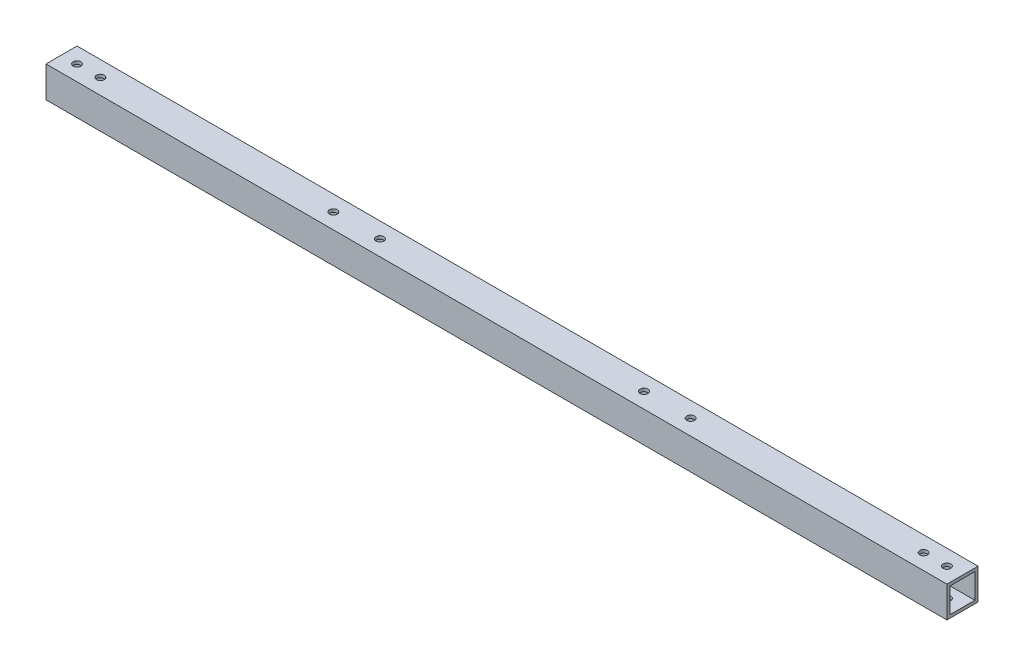
ISO-10303-21;
HEADER;
FILE_DESCRIPTION(('STEP AP214'),'2;1');
FILE_NAME('part.step','',(''),(''),'','','');
FILE_SCHEMA(('AUTOMOTIVE_DESIGN { 1 0 10303 214 1 1 1 1 }'));
ENDSEC;
DATA;
#1=APPLICATION_CONTEXT('core data for automotive mechanical design processes');
#2=APPLICATION_PROTOCOL_DEFINITION('international standard','automotive_design',2000,#1);
#3=PRODUCT_CONTEXT('',#1,'mechanical');
#4=PRODUCT('Part','Part','',(#3));
#5=PRODUCT_RELATED_PRODUCT_CATEGORY('part','',(#4));
#6=PRODUCT_DEFINITION_FORMATION('','',#4);
#7=PRODUCT_DEFINITION_CONTEXT('part definition',#1,'design');
#8=PRODUCT_DEFINITION('design','',#6,#7);
#9=PRODUCT_DEFINITION_SHAPE('','',#8);
#10=(LENGTH_UNIT() NAMED_UNIT(*) SI_UNIT(.MILLI.,.METRE.));
#11=(NAMED_UNIT(*) PLANE_ANGLE_UNIT() SI_UNIT($,.RADIAN.));
#12=(NAMED_UNIT(*) SI_UNIT($,.STERADIAN.) SOLID_ANGLE_UNIT());
#13=UNCERTAINTY_MEASURE_WITH_UNIT(LENGTH_MEASURE(1.E-05),#10,'distance_accuracy_value','');
#14=(GEOMETRIC_REPRESENTATION_CONTEXT(3) GLOBAL_UNCERTAINTY_ASSIGNED_CONTEXT((#13)) GLOBAL_UNIT_ASSIGNED_CONTEXT((#10,
#11,#12)) REPRESENTATION_CONTEXT('',''));
#15=CARTESIAN_POINT('',(0.,0.,0.));
#16=DIRECTION('',(0.,0.,1.));
#17=DIRECTION('',(1.,0.,0.));
#18=AXIS2_PLACEMENT_3D('',#15,#16,#17);
#19=CARTESIAN_POINT('',(580.,0.,0.));
#20=DIRECTION('',(1.,0.,0.));
#21=DIRECTION('',(0.,0.,-1.));
#22=AXIS2_PLACEMENT_3D('',#19,#20,#21);
#23=PLANE('',#22);
#24=DIRECTION('',(0.,1.,0.));
#25=VECTOR('',#24,1.);
#26=CARTESIAN_POINT('',(580.,10.,-9.99999999999999));
#27=LINE('',#26,#25);
#28=CARTESIAN_POINT('',(580.,-10.,-10.));
#29=VERTEX_POINT('',#28);
#30=CARTESIAN_POINT('',(580.,10.,-9.99999999999999));
#31=VERTEX_POINT('',#30);
#32=EDGE_CURVE('E141',#29,#31,#27,.T.);
#33=ORIENTED_EDGE('',*,*,#32,.T.);
#34=DIRECTION('',(0.,0.,1.));
#35=VECTOR('',#34,1.);
#36=CARTESIAN_POINT('',(580.,10.,10.));
#37=LINE('',#36,#35);
#38=CARTESIAN_POINT('',(580.,10.,10.));
#39=VERTEX_POINT('',#38);
#40=EDGE_CURVE('E144',#31,#39,#37,.T.);
#41=ORIENTED_EDGE('',*,*,#40,.T.);
#42=DIRECTION('',(0.,-1.,0.));
#43=VECTOR('',#42,1.);
#44=CARTESIAN_POINT('',(580.,10.,10.));
#45=LINE('',#44,#43);
#46=CARTESIAN_POINT('',(580.,-10.,10.));
#47=VERTEX_POINT('',#46);
#48=EDGE_CURVE('E147',#39,#47,#45,.T.);
#49=ORIENTED_EDGE('',*,*,#48,.T.);
#50=DIRECTION('',(0.,0.,-1.));
#51=VECTOR('',#50,1.);
#52=CARTESIAN_POINT('',(580.,-10.,10.));
#53=LINE('',#52,#51);
#54=EDGE_CURVE('E149',#47,#29,#53,.T.);
#55=ORIENTED_EDGE('',*,*,#54,.T.);
#56=EDGE_LOOP('',(#33,#41,#49,#55));
#57=FACE_BOUND('',#56,.T.);
#58=DIRECTION('',(0.,0.,1.));
#59=VECTOR('',#58,1.);
#60=CARTESIAN_POINT('',(580.,8.,8.));
#61=LINE('',#60,#59);
#62=CARTESIAN_POINT('',(580.,8.,-8.));
#63=VERTEX_POINT('',#62);
#64=CARTESIAN_POINT('',(580.,8.,8.));
#65=VERTEX_POINT('',#64);
#66=EDGE_CURVE('E111',#63,#65,#61,.T.);
#67=ORIENTED_EDGE('',*,*,#66,.F.);
#68=DIRECTION('',(0.,1.,0.));
#69=VECTOR('',#68,1.);
#70=CARTESIAN_POINT('',(580.,8.,-8.));
#71=LINE('',#70,#69);
#72=CARTESIAN_POINT('',(580.,-8.,-8.));
#73=VERTEX_POINT('',#72);
#74=EDGE_CURVE('E103',#73,#63,#71,.T.);
#75=ORIENTED_EDGE('',*,*,#74,.F.);
#76=DIRECTION('',(0.,0.,-1.));
#77=VECTOR('',#76,1.);
#78=CARTESIAN_POINT('',(580.,-8.,8.));
#79=LINE('',#78,#77);
#80=CARTESIAN_POINT('',(580.,-8.,8.));
#81=VERTEX_POINT('',#80);
#82=EDGE_CURVE('E125',#81,#73,#79,.T.);
#83=ORIENTED_EDGE('',*,*,#82,.F.);
#84=DIRECTION('',(0.,-1.,0.));
#85=VECTOR('',#84,1.);
#86=CARTESIAN_POINT('',(580.,8.,8.));
#87=LINE('',#86,#85);
#88=EDGE_CURVE('E123',#65,#81,#87,.T.);
#89=ORIENTED_EDGE('',*,*,#88,.F.);
#90=EDGE_LOOP('',(#67,#75,#83,#89));
#91=FACE_BOUND('',#90,.T.);
#92=ADVANCED_FACE('F36',(#57,#91),#23,.T.);
#93=CARTESIAN_POINT('',(0.,0.,0.));
#94=DIRECTION('',(1.,0.,0.));
#95=DIRECTION('',(0.,0.,-1.));
#96=AXIS2_PLACEMENT_3D('',#93,#94,#95);
#97=PLANE('',#96);
#98=DIRECTION('',(0.,1.,0.));
#99=VECTOR('',#98,1.);
#100=CARTESIAN_POINT('',(0.,10.,-9.99999999999999));
#101=LINE('',#100,#99);
#102=CARTESIAN_POINT('',(0.,-10.,-10.));
#103=VERTEX_POINT('',#102);
#104=CARTESIAN_POINT('',(0.,10.,-9.99999999999999));
#105=VERTEX_POINT('',#104);
#106=EDGE_CURVE('E119',#103,#105,#101,.T.);
#107=ORIENTED_EDGE('',*,*,#106,.F.);
#108=DIRECTION('',(0.,0.,-1.));
#109=VECTOR('',#108,1.);
#110=CARTESIAN_POINT('',(0.,-10.,10.));
#111=LINE('',#110,#109);
#112=CARTESIAN_POINT('',(0.,-10.,10.));
#113=VERTEX_POINT('',#112);
#114=EDGE_CURVE('E145',#113,#103,#111,.T.);
#115=ORIENTED_EDGE('',*,*,#114,.F.);
#116=DIRECTION('',(0.,-1.,0.));
#117=VECTOR('',#116,1.);
#118=CARTESIAN_POINT('',(0.,10.,10.));
#119=LINE('',#118,#117);
#120=CARTESIAN_POINT('',(0.,10.,10.));
#121=VERTEX_POINT('',#120);
#122=EDGE_CURVE('E156',#121,#113,#119,.T.);
#123=ORIENTED_EDGE('',*,*,#122,.F.);
#124=DIRECTION('',(0.,0.,1.));
#125=VECTOR('',#124,1.);
#126=CARTESIAN_POINT('',(0.,10.,10.));
#127=LINE('',#126,#125);
#128=EDGE_CURVE('E154',#105,#121,#127,.T.);
#129=ORIENTED_EDGE('',*,*,#128,.F.);
#130=EDGE_LOOP('',(#107,#115,#123,#129));
#131=FACE_BOUND('',#130,.T.);
#132=DIRECTION('',(0.,1.,0.));
#133=VECTOR('',#132,1.);
#134=CARTESIAN_POINT('',(0.,8.,-8.));
#135=LINE('',#134,#133);
#136=CARTESIAN_POINT('',(0.,-8.,-8.));
#137=VERTEX_POINT('',#136);
#138=CARTESIAN_POINT('',(0.,8.,-8.));
#139=VERTEX_POINT('',#138);
#140=EDGE_CURVE('E61',#137,#139,#135,.T.);
#141=ORIENTED_EDGE('',*,*,#140,.T.);
#142=DIRECTION('',(0.,0.,1.));
#143=VECTOR('',#142,1.);
#144=CARTESIAN_POINT('',(0.,8.,8.));
#145=LINE('',#144,#143);
#146=CARTESIAN_POINT('',(0.,8.,8.));
#147=VERTEX_POINT('',#146);
#148=EDGE_CURVE('E118',#139,#147,#145,.T.);
#149=ORIENTED_EDGE('',*,*,#148,.T.);
#150=DIRECTION('',(0.,-1.,0.));
#151=VECTOR('',#150,1.);
#152=CARTESIAN_POINT('',(0.,8.,8.));
#153=LINE('',#152,#151);
#154=CARTESIAN_POINT('',(0.,-8.,8.));
#155=VERTEX_POINT('',#154);
#156=EDGE_CURVE('E133',#147,#155,#153,.T.);
#157=ORIENTED_EDGE('',*,*,#156,.T.);
#158=DIRECTION('',(0.,0.,-1.));
#159=VECTOR('',#158,1.);
#160=CARTESIAN_POINT('',(0.,-8.,8.));
#161=LINE('',#160,#159);
#162=EDGE_CURVE('E112',#155,#137,#161,.T.);
#163=ORIENTED_EDGE('',*,*,#162,.T.);
#164=EDGE_LOOP('',(#141,#149,#157,#163));
#165=FACE_BOUND('',#164,.T.);
#166=ADVANCED_FACE('F275',(#131,#165),#97,.F.);
#167=CARTESIAN_POINT('',(580.,10.,-9.99999999999999));
#168=DIRECTION('',(0.,0.,1.));
#169=DIRECTION('',(0.,-1.,0.));
#170=AXIS2_PLACEMENT_3D('',#167,#168,#169);
#171=PLANE('',#170);
#172=ORIENTED_EDGE('',*,*,#106,.T.);
#173=DIRECTION('',(-1.,0.,0.));
#174=VECTOR('',#173,1.);
#175=CARTESIAN_POINT('',(580.,10.,-9.99999999999999));
#176=LINE('',#175,#174);
#177=EDGE_CURVE('E11',#31,#105,#176,.T.);
#178=ORIENTED_EDGE('',*,*,#177,.F.);
#179=ORIENTED_EDGE('',*,*,#32,.F.);
#180=DIRECTION('',(-1.,0.,0.));
#181=VECTOR('',#180,1.);
#182=CARTESIAN_POINT('',(580.,-10.,-10.));
#183=LINE('',#182,#181);
#184=EDGE_CURVE('E151',#29,#103,#183,.T.);
#185=ORIENTED_EDGE('',*,*,#184,.T.);
#186=EDGE_LOOP('',(#172,#178,#179,#185));
#187=FACE_BOUND('',#186,.T.);
#188=ADVANCED_FACE('F38',(#187),#171,.F.);
#189=CARTESIAN_POINT('',(580.,10.,10.));
#190=DIRECTION('',(0.,-1.,0.));
#191=DIRECTION('',(0.,0.,-1.));
#192=AXIS2_PLACEMENT_3D('',#189,#190,#191);
#193=PLANE('',#192);
#194=CARTESIAN_POINT('',(175.,10.,0.));
#195=DIRECTION('',(0.,1.,0.));
#196=DIRECTION('',(0.,0.,1.));
#197=AXIS2_PLACEMENT_3D('',#194,#195,#196);
#198=CIRCLE('',#197,2.5);
#199=CARTESIAN_POINT('',(175.,10.,2.5));
#200=VERTEX_POINT('',#199);
#201=EDGE_CURVE('E484',#200,#200,#198,.T.);
#202=ORIENTED_EDGE('',*,*,#201,.F.);
#203=EDGE_LOOP('',(#202));
#204=FACE_BOUND('',#203,.T.);
#205=CARTESIAN_POINT('',(375.,10.,0.));
#206=DIRECTION('',(0.,1.,0.));
#207=DIRECTION('',(0.,0.,1.));
#208=AXIS2_PLACEMENT_3D('',#205,#206,#207);
#209=CIRCLE('',#208,2.50000000000002);
#210=CARTESIAN_POINT('',(375.,10.,2.5));
#211=VERTEX_POINT('',#210);
#212=EDGE_CURVE('E497',#211,#211,#209,.T.);
#213=ORIENTED_EDGE('',*,*,#212,.F.);
#214=EDGE_LOOP('',(#213));
#215=FACE_BOUND('',#214,.T.);
#216=CARTESIAN_POINT('',(205.,10.,0.));
#217=DIRECTION('',(0.,1.,0.));
#218=DIRECTION('',(0.,0.,-1.));
#219=AXIS2_PLACEMENT_3D('',#216,#217,#218);
#220=CIRCLE('',#219,2.5);
#221=CARTESIAN_POINT('',(205.,10.,-2.5));
#222=VERTEX_POINT('',#221);
#223=EDGE_CURVE('E496',#222,#222,#220,.T.);
#224=ORIENTED_EDGE('',*,*,#223,.F.);
#225=EDGE_LOOP('',(#224));
#226=FACE_BOUND('',#225,.T.);
#227=CARTESIAN_POINT('',(405.,10.,0.));
#228=DIRECTION('',(0.,1.,0.));
#229=DIRECTION('',(0.,0.,-1.));
#230=AXIS2_PLACEMENT_3D('',#227,#228,#229);
#231=CIRCLE('',#230,2.49999999999996);
#232=CARTESIAN_POINT('',(405.,10.,-2.49999999999999));
#233=VERTEX_POINT('',#232);
#234=EDGE_CURVE('E490',#233,#233,#231,.T.);
#235=ORIENTED_EDGE('',*,*,#234,.F.);
#236=EDGE_LOOP('',(#235));
#237=FACE_BOUND('',#236,.T.);
#238=CARTESIAN_POINT('',(10.,10.,0.));
#239=DIRECTION('',(0.,1.,0.));
#240=DIRECTION('',(0.,0.,1.));
#241=AXIS2_PLACEMENT_3D('',#238,#239,#240);
#242=CIRCLE('',#241,2.5);
#243=CARTESIAN_POINT('',(10.,10.,2.5));
#244=VERTEX_POINT('',#243);
#245=EDGE_CURVE('E210',#244,#244,#242,.T.);
#246=ORIENTED_EDGE('',*,*,#245,.F.);
#247=EDGE_LOOP('',(#246));
#248=FACE_BOUND('',#247,.T.);
#249=CARTESIAN_POINT('',(555.,10.,1.04744440165294E-13));
#250=DIRECTION('',(0.,1.,0.));
#251=DIRECTION('',(0.,0.,1.));
#252=AXIS2_PLACEMENT_3D('',#249,#250,#251);
#253=CIRCLE('',#252,2.50000000000003);
#254=CARTESIAN_POINT('',(555.,10.,2.50000000000013));
#255=VERTEX_POINT('',#254);
#256=EDGE_CURVE('E207',#255,#255,#253,.T.);
#257=ORIENTED_EDGE('',*,*,#256,.F.);
#258=EDGE_LOOP('',(#257));
#259=FACE_BOUND('',#258,.T.);
#260=CARTESIAN_POINT('',(25.,10.,0.));
#261=DIRECTION('',(0.,1.,0.));
#262=DIRECTION('',(0.,0.,1.));
#263=AXIS2_PLACEMENT_3D('',#260,#261,#262);
#264=CIRCLE('',#263,2.5);
#265=CARTESIAN_POINT('',(25.,10.,2.5));
#266=VERTEX_POINT('',#265);
#267=EDGE_CURVE('E217',#266,#266,#264,.T.);
#268=ORIENTED_EDGE('',*,*,#267,.F.);
#269=EDGE_LOOP('',(#268));
#270=FACE_BOUND('',#269,.T.);
#271=CARTESIAN_POINT('',(570.,10.,0.));
#272=DIRECTION('',(0.,1.,0.));
#273=DIRECTION('',(0.,0.,1.));
#274=AXIS2_PLACEMENT_3D('',#271,#272,#273);
#275=CIRCLE('',#274,2.50000000000003);
#276=CARTESIAN_POINT('',(570.,10.,2.50000000000003));
#277=VERTEX_POINT('',#276);
#278=EDGE_CURVE('E222',#277,#277,#275,.T.);
#279=ORIENTED_EDGE('',*,*,#278,.F.);
#280=EDGE_LOOP('',(#279));
#281=FACE_BOUND('',#280,.T.);
#282=ORIENTED_EDGE('',*,*,#128,.T.);
#283=DIRECTION('',(-1.,0.,0.));
#284=VECTOR('',#283,1.);
#285=CARTESIAN_POINT('',(580.,10.,10.));
#286=LINE('',#285,#284);
#287=EDGE_CURVE('E45',#39,#121,#286,.T.);
#288=ORIENTED_EDGE('',*,*,#287,.F.);
#289=ORIENTED_EDGE('',*,*,#40,.F.);
#290=ORIENTED_EDGE('',*,*,#177,.T.);
#291=EDGE_LOOP('',(#282,#288,#289,#290));
#292=FACE_BOUND('',#291,.T.);
#293=ADVANCED_FACE('F261',(#204,#215,#226,#237,#248,#259,#270,#281,#292),#193,.F.);
#294=CARTESIAN_POINT('',(580.,10.,10.));
#295=DIRECTION('',(0.,0.,-1.));
#296=DIRECTION('',(0.,1.,0.));
#297=AXIS2_PLACEMENT_3D('',#294,#295,#296);
#298=PLANE('',#297);
#299=ORIENTED_EDGE('',*,*,#122,.T.);
#300=DIRECTION('',(-1.,0.,0.));
#301=VECTOR('',#300,1.);
#302=CARTESIAN_POINT('',(580.,-10.,10.));
#303=LINE('',#302,#301);
#304=EDGE_CURVE('E161',#47,#113,#303,.T.);
#305=ORIENTED_EDGE('',*,*,#304,.F.);
#306=ORIENTED_EDGE('',*,*,#48,.F.);
#307=ORIENTED_EDGE('',*,*,#287,.T.);
#308=EDGE_LOOP('',(#299,#305,#306,#307));
#309=FACE_BOUND('',#308,.T.);
#310=ADVANCED_FACE('F264',(#309),#298,.F.);
#311=CARTESIAN_POINT('',(580.,-10.,10.));
#312=DIRECTION('',(0.,1.,0.));
#313=DIRECTION('',(0.,0.,1.));
#314=AXIS2_PLACEMENT_3D('',#311,#312,#313);
#315=PLANE('',#314);
#316=CARTESIAN_POINT('',(175.,-10.,0.));
#317=DIRECTION('',(0.,1.,0.));
#318=DIRECTION('',(0.,0.,1.));
#319=AXIS2_PLACEMENT_3D('',#316,#317,#318);
#320=CIRCLE('',#319,2.5);
#321=CARTESIAN_POINT('',(175.,-10.,2.5));
#322=VERTEX_POINT('',#321);
#323=EDGE_CURVE('E186',#322,#322,#320,.T.);
#324=ORIENTED_EDGE('',*,*,#323,.T.);
#325=EDGE_LOOP('',(#324));
#326=FACE_BOUND('',#325,.T.);
#327=CARTESIAN_POINT('',(375.,-10.,0.));
#328=DIRECTION('',(0.,1.,0.));
#329=DIRECTION('',(0.,0.,1.));
#330=AXIS2_PLACEMENT_3D('',#327,#328,#329);
#331=CIRCLE('',#330,2.50000000000002);
#332=CARTESIAN_POINT('',(375.,-10.,2.5));
#333=VERTEX_POINT('',#332);
#334=EDGE_CURVE('E493',#333,#333,#331,.T.);
#335=ORIENTED_EDGE('',*,*,#334,.T.);
#336=EDGE_LOOP('',(#335));
#337=FACE_BOUND('',#336,.T.);
#338=CARTESIAN_POINT('',(205.,-10.,0.));
#339=DIRECTION('',(0.,1.,0.));
#340=DIRECTION('',(0.,0.,-1.));
#341=AXIS2_PLACEMENT_3D('',#338,#339,#340);
#342=CIRCLE('',#341,2.5);
#343=CARTESIAN_POINT('',(205.,-10.,-2.5));
#344=VERTEX_POINT('',#343);
#345=EDGE_CURVE('E502',#344,#344,#342,.T.);
#346=ORIENTED_EDGE('',*,*,#345,.T.);
#347=EDGE_LOOP('',(#346));
#348=FACE_BOUND('',#347,.T.);
#349=CARTESIAN_POINT('',(405.,-10.,0.));
#350=DIRECTION('',(0.,1.,0.));
#351=DIRECTION('',(0.,0.,-1.));
#352=AXIS2_PLACEMENT_3D('',#349,#350,#351);
#353=CIRCLE('',#352,2.49999999999996);
#354=CARTESIAN_POINT('',(405.,-10.,-2.49999999999999));
#355=VERTEX_POINT('',#354);
#356=EDGE_CURVE('E485',#355,#355,#353,.T.);
#357=ORIENTED_EDGE('',*,*,#356,.T.);
#358=EDGE_LOOP('',(#357));
#359=FACE_BOUND('',#358,.T.);
#360=CARTESIAN_POINT('',(10.,-10.,0.));
#361=DIRECTION('',(0.,1.,0.));
#362=DIRECTION('',(0.,0.,1.));
#363=AXIS2_PLACEMENT_3D('',#360,#361,#362);
#364=CIRCLE('',#363,2.5);
#365=CARTESIAN_POINT('',(10.,-10.,2.5));
#366=VERTEX_POINT('',#365);
#367=EDGE_CURVE('E170',#366,#366,#364,.T.);
#368=ORIENTED_EDGE('',*,*,#367,.T.);
#369=EDGE_LOOP('',(#368));
#370=FACE_BOUND('',#369,.T.);
#371=CARTESIAN_POINT('',(555.,-10.,1.04744440165294E-13));
#372=DIRECTION('',(0.,1.,0.));
#373=DIRECTION('',(0.,0.,1.));
#374=AXIS2_PLACEMENT_3D('',#371,#372,#373);
#375=CIRCLE('',#374,2.50000000000003);
#376=CARTESIAN_POINT('',(555.,-10.,2.50000000000013));
#377=VERTEX_POINT('',#376);
#378=EDGE_CURVE('E214',#377,#377,#375,.T.);
#379=ORIENTED_EDGE('',*,*,#378,.T.);
#380=EDGE_LOOP('',(#379));
#381=FACE_BOUND('',#380,.T.);
#382=CARTESIAN_POINT('',(25.,-10.,0.));
#383=DIRECTION('',(0.,1.,0.));
#384=DIRECTION('',(0.,0.,1.));
#385=AXIS2_PLACEMENT_3D('',#382,#383,#384);
#386=CIRCLE('',#385,2.5);
#387=CARTESIAN_POINT('',(25.,-10.,2.5));
#388=VERTEX_POINT('',#387);
#389=EDGE_CURVE('E225',#388,#388,#386,.T.);
#390=ORIENTED_EDGE('',*,*,#389,.T.);
#391=EDGE_LOOP('',(#390));
#392=FACE_BOUND('',#391,.T.);
#393=CARTESIAN_POINT('',(570.,-10.,0.));
#394=DIRECTION('',(0.,1.,0.));
#395=DIRECTION('',(0.,0.,1.));
#396=AXIS2_PLACEMENT_3D('',#393,#394,#395);
#397=CIRCLE('',#396,2.50000000000003);
#398=CARTESIAN_POINT('',(570.,-10.,2.50000000000003));
#399=VERTEX_POINT('',#398);
#400=EDGE_CURVE('E213',#399,#399,#397,.T.);
#401=ORIENTED_EDGE('',*,*,#400,.T.);
#402=EDGE_LOOP('',(#401));
#403=FACE_BOUND('',#402,.T.);
#404=ORIENTED_EDGE('',*,*,#114,.T.);
#405=ORIENTED_EDGE('',*,*,#184,.F.);
#406=ORIENTED_EDGE('',*,*,#54,.F.);
#407=ORIENTED_EDGE('',*,*,#304,.T.);
#408=EDGE_LOOP('',(#404,#405,#406,#407));
#409=FACE_BOUND('',#408,.T.);
#410=ADVANCED_FACE('F279',(#326,#337,#348,#359,#370,#381,#392,#403,#409),#315,.F.);
#411=CARTESIAN_POINT('',(580.,8.,-8.));
#412=DIRECTION('',(0.,0.,1.));
#413=DIRECTION('',(0.,-1.,0.));
#414=AXIS2_PLACEMENT_3D('',#411,#412,#413);
#415=PLANE('',#414);
#416=ORIENTED_EDGE('',*,*,#140,.F.);
#417=DIRECTION('',(-1.,0.,0.));
#418=VECTOR('',#417,1.);
#419=CARTESIAN_POINT('',(580.,-8.,-8.));
#420=LINE('',#419,#418);
#421=EDGE_CURVE('E107',#73,#137,#420,.T.);
#422=ORIENTED_EDGE('',*,*,#421,.F.);
#423=ORIENTED_EDGE('',*,*,#74,.T.);
#424=DIRECTION('',(-1.,0.,0.));
#425=VECTOR('',#424,1.);
#426=CARTESIAN_POINT('',(580.,8.,-8.));
#427=LINE('',#426,#425);
#428=EDGE_CURVE('E106',#63,#139,#427,.T.);
#429=ORIENTED_EDGE('',*,*,#428,.T.);
#430=EDGE_LOOP('',(#416,#422,#423,#429));
#431=FACE_BOUND('',#430,.T.);
#432=ADVANCED_FACE('F105',(#431),#415,.T.);
#433=CARTESIAN_POINT('',(580.,8.,8.));
#434=DIRECTION('',(0.,-1.,0.));
#435=DIRECTION('',(0.,0.,-1.));
#436=AXIS2_PLACEMENT_3D('',#433,#434,#435);
#437=PLANE('',#436);
#438=CARTESIAN_POINT('',(175.,8.,0.));
#439=DIRECTION('',(0.,-1.,0.));
#440=DIRECTION('',(0.,0.,-1.));
#441=AXIS2_PLACEMENT_3D('',#438,#439,#440);
#442=CIRCLE('',#441,2.5);
#443=CARTESIAN_POINT('',(175.,8.,-2.5));
#444=VERTEX_POINT('',#443);
#445=EDGE_CURVE('E204',#444,#444,#442,.T.);
#446=ORIENTED_EDGE('',*,*,#445,.F.);
#447=EDGE_LOOP('',(#446));
#448=FACE_BOUND('',#447,.T.);
#449=CARTESIAN_POINT('',(375.,8.,0.));
#450=DIRECTION('',(0.,-1.,0.));
#451=DIRECTION('',(0.,0.,-1.));
#452=AXIS2_PLACEMENT_3D('',#449,#450,#451);
#453=CIRCLE('',#452,2.50000000000002);
#454=CARTESIAN_POINT('',(375.,8.,-2.50000000000005));
#455=VERTEX_POINT('',#454);
#456=EDGE_CURVE('E192',#455,#455,#453,.T.);
#457=ORIENTED_EDGE('',*,*,#456,.F.);
#458=EDGE_LOOP('',(#457));
#459=FACE_BOUND('',#458,.T.);
#460=CARTESIAN_POINT('',(205.,8.,0.));
#461=DIRECTION('',(0.,-1.,0.));
#462=DIRECTION('',(0.,0.,-1.));
#463=AXIS2_PLACEMENT_3D('',#460,#461,#462);
#464=CIRCLE('',#463,2.5);
#465=CARTESIAN_POINT('',(205.,8.,-2.5));
#466=VERTEX_POINT('',#465);
#467=EDGE_CURVE('E189',#466,#466,#464,.T.);
#468=ORIENTED_EDGE('',*,*,#467,.F.);
#469=EDGE_LOOP('',(#468));
#470=FACE_BOUND('',#469,.T.);
#471=CARTESIAN_POINT('',(405.,8.,0.));
#472=DIRECTION('',(0.,-1.,0.));
#473=DIRECTION('',(0.,0.,-1.));
#474=AXIS2_PLACEMENT_3D('',#471,#472,#473);
#475=CIRCLE('',#474,2.49999999999996);
#476=CARTESIAN_POINT('',(405.,8.,-2.49999999999999));
#477=VERTEX_POINT('',#476);
#478=EDGE_CURVE('E185',#477,#477,#475,.T.);
#479=ORIENTED_EDGE('',*,*,#478,.F.);
#480=EDGE_LOOP('',(#479));
#481=FACE_BOUND('',#480,.T.);
#482=CARTESIAN_POINT('',(10.,8.,0.));
#483=DIRECTION('',(0.,-1.,0.));
#484=DIRECTION('',(0.,0.,-1.));
#485=AXIS2_PLACEMENT_3D('',#482,#483,#484);
#486=CIRCLE('',#485,2.5);
#487=CARTESIAN_POINT('',(10.,8.,-2.5));
#488=VERTEX_POINT('',#487);
#489=EDGE_CURVE('E131',#488,#488,#486,.T.);
#490=ORIENTED_EDGE('',*,*,#489,.F.);
#491=EDGE_LOOP('',(#490));
#492=FACE_BOUND('',#491,.T.);
#493=CARTESIAN_POINT('',(555.,8.,1.04744440165294E-13));
#494=DIRECTION('',(0.,-1.,0.));
#495=DIRECTION('',(0.,0.,-1.));
#496=AXIS2_PLACEMENT_3D('',#493,#494,#495);
#497=CIRCLE('',#496,2.50000000000003);
#498=CARTESIAN_POINT('',(555.,8.,-2.49999999999992));
#499=VERTEX_POINT('',#498);
#500=EDGE_CURVE('E178',#499,#499,#497,.T.);
#501=ORIENTED_EDGE('',*,*,#500,.F.);
#502=EDGE_LOOP('',(#501));
#503=FACE_BOUND('',#502,.T.);
#504=CARTESIAN_POINT('',(25.,8.,0.));
#505=DIRECTION('',(0.,-1.,0.));
#506=DIRECTION('',(0.,0.,-1.));
#507=AXIS2_PLACEMENT_3D('',#504,#505,#506);
#508=CIRCLE('',#507,2.5);
#509=CARTESIAN_POINT('',(25.,8.,-2.5));
#510=VERTEX_POINT('',#509);
#511=EDGE_CURVE('E174',#510,#510,#508,.T.);
#512=ORIENTED_EDGE('',*,*,#511,.F.);
#513=EDGE_LOOP('',(#512));
#514=FACE_BOUND('',#513,.T.);
#515=CARTESIAN_POINT('',(570.,8.,0.));
#516=DIRECTION('',(0.,-1.,0.));
#517=DIRECTION('',(0.,0.,-1.));
#518=AXIS2_PLACEMENT_3D('',#515,#516,#517);
#519=CIRCLE('',#518,2.50000000000003);
#520=CARTESIAN_POINT('',(570.,8.,-2.50000000000003));
#521=VERTEX_POINT('',#520);
#522=EDGE_CURVE('E169',#521,#521,#519,.T.);
#523=ORIENTED_EDGE('',*,*,#522,.F.);
#524=EDGE_LOOP('',(#523));
#525=FACE_BOUND('',#524,.T.);
#526=ORIENTED_EDGE('',*,*,#148,.F.);
#527=ORIENTED_EDGE('',*,*,#428,.F.);
#528=ORIENTED_EDGE('',*,*,#66,.T.);
#529=DIRECTION('',(-1.,0.,0.));
#530=VECTOR('',#529,1.);
#531=CARTESIAN_POINT('',(580.,8.,8.));
#532=LINE('',#531,#530);
#533=EDGE_CURVE('E120',#65,#147,#532,.T.);
#534=ORIENTED_EDGE('',*,*,#533,.T.);
#535=EDGE_LOOP('',(#526,#527,#528,#534));
#536=FACE_BOUND('',#535,.T.);
#537=ADVANCED_FACE('F115',(#448,#459,#470,#481,#492,#503,#514,#525,#536),#437,.T.);
#538=CARTESIAN_POINT('',(580.,8.,8.));
#539=DIRECTION('',(0.,0.,-1.));
#540=DIRECTION('',(0.,1.,0.));
#541=AXIS2_PLACEMENT_3D('',#538,#539,#540);
#542=PLANE('',#541);
#543=ORIENTED_EDGE('',*,*,#156,.F.);
#544=ORIENTED_EDGE('',*,*,#533,.F.);
#545=ORIENTED_EDGE('',*,*,#88,.T.);
#546=DIRECTION('',(-1.,0.,0.));
#547=VECTOR('',#546,1.);
#548=CARTESIAN_POINT('',(580.,-8.,8.));
#549=LINE('',#548,#547);
#550=EDGE_CURVE('E53',#81,#155,#549,.T.);
#551=ORIENTED_EDGE('',*,*,#550,.T.);
#552=EDGE_LOOP('',(#543,#544,#545,#551));
#553=FACE_BOUND('',#552,.T.);
#554=ADVANCED_FACE('F243',(#553),#542,.T.);
#555=CARTESIAN_POINT('',(580.,-8.,8.));
#556=DIRECTION('',(0.,1.,0.));
#557=DIRECTION('',(0.,0.,1.));
#558=AXIS2_PLACEMENT_3D('',#555,#556,#557);
#559=PLANE('',#558);
#560=CARTESIAN_POINT('',(175.,-8.,0.));
#561=DIRECTION('',(0.,1.,0.));
#562=DIRECTION('',(0.,0.,1.));
#563=AXIS2_PLACEMENT_3D('',#560,#561,#562);
#564=CIRCLE('',#563,2.5);
#565=CARTESIAN_POINT('',(175.,-8.,2.5));
#566=VERTEX_POINT('',#565);
#567=EDGE_CURVE('E40',#566,#566,#564,.T.);
#568=ORIENTED_EDGE('',*,*,#567,.F.);
#569=EDGE_LOOP('',(#568));
#570=FACE_BOUND('',#569,.T.);
#571=CARTESIAN_POINT('',(375.,-8.,0.));
#572=DIRECTION('',(0.,1.,0.));
#573=DIRECTION('',(0.,0.,1.));
#574=AXIS2_PLACEMENT_3D('',#571,#572,#573);
#575=CIRCLE('',#574,2.50000000000002);
#576=CARTESIAN_POINT('',(375.,-8.,2.5));
#577=VERTEX_POINT('',#576);
#578=EDGE_CURVE('E190',#577,#577,#575,.T.);
#579=ORIENTED_EDGE('',*,*,#578,.F.);
#580=EDGE_LOOP('',(#579));
#581=FACE_BOUND('',#580,.T.);
#582=CARTESIAN_POINT('',(205.,-8.,0.));
#583=DIRECTION('',(0.,1.,0.));
#584=DIRECTION('',(0.,0.,1.));
#585=AXIS2_PLACEMENT_3D('',#582,#583,#584);
#586=CIRCLE('',#585,2.5);
#587=CARTESIAN_POINT('',(205.,-8.,2.49999999999999));
#588=VERTEX_POINT('',#587);
#589=EDGE_CURVE('E187',#588,#588,#586,.T.);
#590=ORIENTED_EDGE('',*,*,#589,.F.);
#591=EDGE_LOOP('',(#590));
#592=FACE_BOUND('',#591,.T.);
#593=CARTESIAN_POINT('',(405.,-8.,0.));
#594=DIRECTION('',(0.,1.,0.));
#595=DIRECTION('',(0.,0.,1.));
#596=AXIS2_PLACEMENT_3D('',#593,#594,#595);
#597=CIRCLE('',#596,2.49999999999996);
#598=CARTESIAN_POINT('',(405.,-8.,2.49999999999994));
#599=VERTEX_POINT('',#598);
#600=EDGE_CURVE('E182',#599,#599,#597,.T.);
#601=ORIENTED_EDGE('',*,*,#600,.F.);
#602=EDGE_LOOP('',(#601));
#603=FACE_BOUND('',#602,.T.);
#604=CARTESIAN_POINT('',(10.,-8.,0.));
#605=DIRECTION('',(0.,1.,0.));
#606=DIRECTION('',(0.,0.,1.));
#607=AXIS2_PLACEMENT_3D('',#604,#605,#606);
#608=CIRCLE('',#607,2.5);
#609=CARTESIAN_POINT('',(10.,-8.,2.5));
#610=VERTEX_POINT('',#609);
#611=EDGE_CURVE('E179',#610,#610,#608,.T.);
#612=ORIENTED_EDGE('',*,*,#611,.F.);
#613=EDGE_LOOP('',(#612));
#614=FACE_BOUND('',#613,.T.);
#615=CARTESIAN_POINT('',(555.,-8.,1.04744440165294E-13));
#616=DIRECTION('',(0.,1.,0.));
#617=DIRECTION('',(0.,0.,1.));
#618=AXIS2_PLACEMENT_3D('',#615,#616,#617);
#619=CIRCLE('',#618,2.50000000000003);
#620=CARTESIAN_POINT('',(555.,-8.,2.50000000000013));
#621=VERTEX_POINT('',#620);
#622=EDGE_CURVE('E175',#621,#621,#619,.T.);
#623=ORIENTED_EDGE('',*,*,#622,.F.);
#624=EDGE_LOOP('',(#623));
#625=FACE_BOUND('',#624,.T.);
#626=CARTESIAN_POINT('',(25.,-8.,0.));
#627=DIRECTION('',(0.,1.,0.));
#628=DIRECTION('',(0.,0.,1.));
#629=AXIS2_PLACEMENT_3D('',#626,#627,#628);
#630=CIRCLE('',#629,2.5);
#631=CARTESIAN_POINT('',(25.,-8.,2.5));
#632=VERTEX_POINT('',#631);
#633=EDGE_CURVE('E171',#632,#632,#630,.T.);
#634=ORIENTED_EDGE('',*,*,#633,.F.);
#635=EDGE_LOOP('',(#634));
#636=FACE_BOUND('',#635,.T.);
#637=CARTESIAN_POINT('',(570.,-8.,0.));
#638=DIRECTION('',(0.,1.,0.));
#639=DIRECTION('',(0.,0.,1.));
#640=AXIS2_PLACEMENT_3D('',#637,#638,#639);
#641=CIRCLE('',#640,2.50000000000003);
#642=CARTESIAN_POINT('',(570.,-8.,2.50000000000003));
#643=VERTEX_POINT('',#642);
#644=EDGE_CURVE('E166',#643,#643,#641,.T.);
#645=ORIENTED_EDGE('',*,*,#644,.F.);
#646=EDGE_LOOP('',(#645));
#647=FACE_BOUND('',#646,.T.);
#648=ORIENTED_EDGE('',*,*,#162,.F.);
#649=ORIENTED_EDGE('',*,*,#550,.F.);
#650=ORIENTED_EDGE('',*,*,#82,.T.);
#651=ORIENTED_EDGE('',*,*,#421,.T.);
#652=EDGE_LOOP('',(#648,#649,#650,#651));
#653=FACE_BOUND('',#652,.T.);
#654=ADVANCED_FACE('F328',(#570,#581,#592,#603,#614,#625,#636,#647,#653),#559,.T.);
#655=CARTESIAN_POINT('',(570.,-10.,0.));
#656=DIRECTION('',(0.,1.,0.));
#657=DIRECTION('',(0.,0.,1.));
#658=AXIS2_PLACEMENT_3D('',#655,#656,#657);
#659=CYLINDRICAL_SURFACE('',#658,2.50000000000003);
#660=ORIENTED_EDGE('',*,*,#644,.T.);
#661=EDGE_LOOP('',(#660));
#662=FACE_BOUND('',#661,.T.);
#663=ORIENTED_EDGE('',*,*,#400,.F.);
#664=EDGE_LOOP('',(#663));
#665=FACE_BOUND('',#664,.T.);
#666=ADVANCED_FACE('F258',(#662,#665),#659,.F.);
#667=CARTESIAN_POINT('',(25.,-10.,0.));
#668=DIRECTION('',(0.,1.,0.));
#669=DIRECTION('',(0.,0.,1.));
#670=AXIS2_PLACEMENT_3D('',#667,#668,#669);
#671=CYLINDRICAL_SURFACE('',#670,2.5);
#672=ORIENTED_EDGE('',*,*,#633,.T.);
#673=EDGE_LOOP('',(#672));
#674=FACE_BOUND('',#673,.T.);
#675=ORIENTED_EDGE('',*,*,#389,.F.);
#676=EDGE_LOOP('',(#675));
#677=FACE_BOUND('',#676,.T.);
#678=ADVANCED_FACE('F345',(#674,#677),#671,.F.);
#679=CARTESIAN_POINT('',(555.,-10.,1.04744440165294E-13));
#680=DIRECTION('',(0.,1.,0.));
#681=DIRECTION('',(0.,0.,1.));
#682=AXIS2_PLACEMENT_3D('',#679,#680,#681);
#683=CYLINDRICAL_SURFACE('',#682,2.50000000000003);
#684=ORIENTED_EDGE('',*,*,#622,.T.);
#685=EDGE_LOOP('',(#684));
#686=FACE_BOUND('',#685,.T.);
#687=ORIENTED_EDGE('',*,*,#378,.F.);
#688=EDGE_LOOP('',(#687));
#689=FACE_BOUND('',#688,.T.);
#690=ADVANCED_FACE('F351',(#686,#689),#683,.F.);
#691=CARTESIAN_POINT('',(10.,-10.,0.));
#692=DIRECTION('',(0.,1.,0.));
#693=DIRECTION('',(0.,0.,1.));
#694=AXIS2_PLACEMENT_3D('',#691,#692,#693);
#695=CYLINDRICAL_SURFACE('',#694,2.5);
#696=ORIENTED_EDGE('',*,*,#611,.T.);
#697=EDGE_LOOP('',(#696));
#698=FACE_BOUND('',#697,.T.);
#699=ORIENTED_EDGE('',*,*,#367,.F.);
#700=EDGE_LOOP('',(#699));
#701=FACE_BOUND('',#700,.T.);
#702=ADVANCED_FACE('F256',(#698,#701),#695,.F.);
#703=ORIENTED_EDGE('',*,*,#522,.T.);
#704=EDGE_LOOP('',(#703));
#705=FACE_BOUND('',#704,.T.);
#706=ORIENTED_EDGE('',*,*,#278,.T.);
#707=EDGE_LOOP('',(#706));
#708=FACE_BOUND('',#707,.T.);
#709=ADVANCED_FACE('F252',(#705,#708),#659,.F.);
#710=ORIENTED_EDGE('',*,*,#511,.T.);
#711=EDGE_LOOP('',(#710));
#712=FACE_BOUND('',#711,.T.);
#713=ORIENTED_EDGE('',*,*,#267,.T.);
#714=EDGE_LOOP('',(#713));
#715=FACE_BOUND('',#714,.T.);
#716=ADVANCED_FACE('F255',(#712,#715),#671,.F.);
#717=ORIENTED_EDGE('',*,*,#500,.T.);
#718=EDGE_LOOP('',(#717));
#719=FACE_BOUND('',#718,.T.);
#720=ORIENTED_EDGE('',*,*,#256,.T.);
#721=EDGE_LOOP('',(#720));
#722=FACE_BOUND('',#721,.T.);
#723=ADVANCED_FACE('F361',(#719,#722),#683,.F.);
#724=ORIENTED_EDGE('',*,*,#489,.T.);
#725=EDGE_LOOP('',(#724));
#726=FACE_BOUND('',#725,.T.);
#727=ORIENTED_EDGE('',*,*,#245,.T.);
#728=EDGE_LOOP('',(#727));
#729=FACE_BOUND('',#728,.T.);
#730=ADVANCED_FACE('F238',(#726,#729),#695,.F.);
#731=CARTESIAN_POINT('',(405.,-10.,0.));
#732=DIRECTION('',(0.,1.,0.));
#733=DIRECTION('',(0.,0.,1.));
#734=AXIS2_PLACEMENT_3D('',#731,#732,#733);
#735=CYLINDRICAL_SURFACE('',#734,2.49999999999996);
#736=ORIENTED_EDGE('',*,*,#600,.T.);
#737=EDGE_LOOP('',(#736));
#738=FACE_BOUND('',#737,.T.);
#739=ORIENTED_EDGE('',*,*,#356,.F.);
#740=EDGE_LOOP('',(#739));
#741=FACE_BOUND('',#740,.T.);
#742=ADVANCED_FACE('F390',(#738,#741),#735,.F.);
#743=CARTESIAN_POINT('',(205.,-10.,0.));
#744=DIRECTION('',(0.,1.,0.));
#745=DIRECTION('',(0.,0.,1.));
#746=AXIS2_PLACEMENT_3D('',#743,#744,#745);
#747=CYLINDRICAL_SURFACE('',#746,2.5);
#748=ORIENTED_EDGE('',*,*,#589,.T.);
#749=EDGE_LOOP('',(#748));
#750=FACE_BOUND('',#749,.T.);
#751=ORIENTED_EDGE('',*,*,#345,.F.);
#752=EDGE_LOOP('',(#751));
#753=FACE_BOUND('',#752,.T.);
#754=ADVANCED_FACE('F395',(#750,#753),#747,.F.);
#755=CARTESIAN_POINT('',(375.,-10.,0.));
#756=DIRECTION('',(0.,1.,0.));
#757=DIRECTION('',(0.,0.,1.));
#758=AXIS2_PLACEMENT_3D('',#755,#756,#757);
#759=CYLINDRICAL_SURFACE('',#758,2.50000000000002);
#760=ORIENTED_EDGE('',*,*,#578,.T.);
#761=EDGE_LOOP('',(#760));
#762=FACE_BOUND('',#761,.T.);
#763=ORIENTED_EDGE('',*,*,#334,.F.);
#764=EDGE_LOOP('',(#763));
#765=FACE_BOUND('',#764,.T.);
#766=ADVANCED_FACE('F404',(#762,#765),#759,.F.);
#767=CARTESIAN_POINT('',(175.,-10.,0.));
#768=DIRECTION('',(0.,1.,0.));
#769=DIRECTION('',(0.,0.,1.));
#770=AXIS2_PLACEMENT_3D('',#767,#768,#769);
#771=CYLINDRICAL_SURFACE('',#770,2.5);
#772=ORIENTED_EDGE('',*,*,#567,.T.);
#773=EDGE_LOOP('',(#772));
#774=FACE_BOUND('',#773,.T.);
#775=ORIENTED_EDGE('',*,*,#323,.F.);
#776=EDGE_LOOP('',(#775));
#777=FACE_BOUND('',#776,.T.);
#778=ADVANCED_FACE('F413',(#774,#777),#771,.F.);
#779=ORIENTED_EDGE('',*,*,#478,.T.);
#780=EDGE_LOOP('',(#779));
#781=FACE_BOUND('',#780,.T.);
#782=ORIENTED_EDGE('',*,*,#234,.T.);
#783=EDGE_LOOP('',(#782));
#784=FACE_BOUND('',#783,.T.);
#785=ADVANCED_FACE('F398',(#781,#784),#735,.F.);
#786=ORIENTED_EDGE('',*,*,#467,.T.);
#787=EDGE_LOOP('',(#786));
#788=FACE_BOUND('',#787,.T.);
#789=ORIENTED_EDGE('',*,*,#223,.T.);
#790=EDGE_LOOP('',(#789));
#791=FACE_BOUND('',#790,.T.);
#792=ADVANCED_FACE('F407',(#788,#791),#747,.F.);
#793=ORIENTED_EDGE('',*,*,#456,.T.);
#794=EDGE_LOOP('',(#793));
#795=FACE_BOUND('',#794,.T.);
#796=ORIENTED_EDGE('',*,*,#212,.T.);
#797=EDGE_LOOP('',(#796));
#798=FACE_BOUND('',#797,.T.);
#799=ADVANCED_FACE('F415',(#795,#798),#759,.F.);
#800=ORIENTED_EDGE('',*,*,#445,.T.);
#801=EDGE_LOOP('',(#800));
#802=FACE_BOUND('',#801,.T.);
#803=ORIENTED_EDGE('',*,*,#201,.T.);
#804=EDGE_LOOP('',(#803));
#805=FACE_BOUND('',#804,.T.);
#806=ADVANCED_FACE('F423',(#802,#805),#771,.F.);
#807=CLOSED_SHELL('',(#92,#166,#188,#293,#310,#410,#432,#537,#554,#654,#666,#678,#690,#702,#709,
#716,#723,#730,#742,#754,#766,#778,#785,#792,#799,#806));
#808=MANIFOLD_SOLID_BREP('B2',#807);
#809=ADVANCED_BREP_SHAPE_REPRESENTATION('',(#18,#808),#14);
#810=SHAPE_DEFINITION_REPRESENTATION(#9,#809);
ENDSEC;
END-ISO-10303-21;
